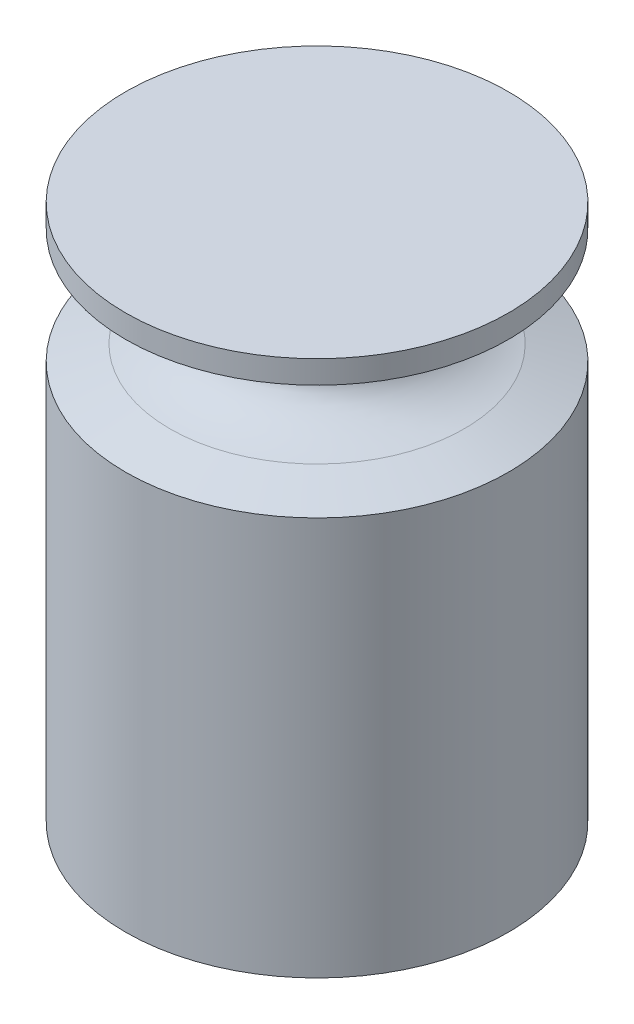
ISO-10303-21;
HEADER;
FILE_DESCRIPTION(('STEP AP214'),'2;1');
FILE_NAME('part.step','',(''),(''),'','','');
FILE_SCHEMA(('AUTOMOTIVE_DESIGN { 1 0 10303 214 1 1 1 1 }'));
ENDSEC;
DATA;
#1=APPLICATION_CONTEXT('core data for automotive mechanical design processes');
#2=APPLICATION_PROTOCOL_DEFINITION('international standard','automotive_design',2000,#1);
#3=PRODUCT_CONTEXT('',#1,'mechanical');
#4=PRODUCT('Part','Part','',(#3));
#5=PRODUCT_RELATED_PRODUCT_CATEGORY('part','',(#4));
#6=PRODUCT_DEFINITION_FORMATION('','',#4);
#7=PRODUCT_DEFINITION_CONTEXT('part definition',#1,'design');
#8=PRODUCT_DEFINITION('design','',#6,#7);
#9=PRODUCT_DEFINITION_SHAPE('','',#8);
#10=(LENGTH_UNIT() NAMED_UNIT(*) SI_UNIT(.MILLI.,.METRE.));
#11=(NAMED_UNIT(*) PLANE_ANGLE_UNIT() SI_UNIT($,.RADIAN.));
#12=(NAMED_UNIT(*) SI_UNIT($,.STERADIAN.) SOLID_ANGLE_UNIT());
#13=UNCERTAINTY_MEASURE_WITH_UNIT(LENGTH_MEASURE(1.E-05),#10,'distance_accuracy_value','');
#14=(GEOMETRIC_REPRESENTATION_CONTEXT(3) GLOBAL_UNCERTAINTY_ASSIGNED_CONTEXT((#13)) GLOBAL_UNIT_ASSIGNED_CONTEXT((#10,
#11,#12)) REPRESENTATION_CONTEXT('',''));
#15=CARTESIAN_POINT('',(0.,0.,0.));
#16=DIRECTION('',(0.,0.,1.));
#17=DIRECTION('',(1.,0.,0.));
#18=AXIS2_PLACEMENT_3D('',#15,#16,#17);
#19=CARTESIAN_POINT('',(0.,70.,0.));
#20=DIRECTION('',(0.,-1.,0.));
#21=DIRECTION('',(0.,0.,-1.));
#22=AXIS2_PLACEMENT_3D('',#19,#20,#21);
#23=CYLINDRICAL_SURFACE('',#22,25.);
#24=CARTESIAN_POINT('',(0.,52.,0.));
#25=DIRECTION('',(0.,1.,0.));
#26=DIRECTION('',(0.,0.,1.));
#27=AXIS2_PLACEMENT_3D('',#24,#25,#26);
#28=CIRCLE('',#27,25.);
#29=CARTESIAN_POINT('',(0.,52.,25.));
#30=VERTEX_POINT('',#29);
#31=EDGE_CURVE('E47',#30,#30,#28,.T.);
#32=ORIENTED_EDGE('',*,*,#31,.F.);
#33=EDGE_LOOP('',(#32));
#34=FACE_BOUND('',#33,.T.);
#35=CARTESIAN_POINT('',(0.,0.,0.));
#36=DIRECTION('',(0.,1.,0.));
#37=DIRECTION('',(0.,0.,1.));
#38=AXIS2_PLACEMENT_3D('',#35,#36,#37);
#39=CIRCLE('',#38,25.);
#40=CARTESIAN_POINT('',(0.,0.,25.));
#41=VERTEX_POINT('',#40);
#42=EDGE_CURVE('E40',#41,#41,#39,.T.);
#43=ORIENTED_EDGE('',*,*,#42,.T.);
#44=EDGE_LOOP('',(#43));
#45=FACE_BOUND('',#44,.T.);
#46=ADVANCED_FACE('F36',(#34,#45),#23,.T.);
#47=CARTESIAN_POINT('',(0.,0.,0.));
#48=DIRECTION('',(0.,1.,0.));
#49=DIRECTION('',(0.,0.,1.));
#50=AXIS2_PLACEMENT_3D('',#47,#48,#49);
#51=PLANE('',#50);
#52=ORIENTED_EDGE('',*,*,#42,.F.);
#53=EDGE_LOOP('',(#52));
#54=FACE_BOUND('',#53,.T.);
#55=ADVANCED_FACE('F76',(#54),#51,.F.);
#56=CARTESIAN_POINT('',(0.,52.,0.));
#57=DIRECTION('',(0.,-1.,0.));
#58=DIRECTION('',(0.,0.,-1.));
#59=AXIS2_PLACEMENT_3D('',#56,#57,#58);
#60=CONICAL_SURFACE('',#59,25.,1.23836614702557);
#61=CARTESIAN_POINT('',(0.,54.,0.));
#62=DIRECTION('',(0.,1.,0.));
#63=DIRECTION('',(0.,0.,1.));
#64=AXIS2_PLACEMENT_3D('',#61,#62,#63);
#65=CIRCLE('',#64,19.2069693119544);
#66=CARTESIAN_POINT('',(0.,54.,19.2069693119544));
#67=VERTEX_POINT('',#66);
#68=EDGE_CURVE('E51',#67,#67,#65,.T.);
#69=ORIENTED_EDGE('',*,*,#68,.F.);
#70=EDGE_LOOP('',(#69));
#71=FACE_BOUND('',#70,.T.);
#72=ORIENTED_EDGE('',*,*,#31,.T.);
#73=EDGE_LOOP('',(#72));
#74=FACE_BOUND('',#73,.T.);
#75=ADVANCED_FACE('F72',(#71,#74),#60,.T.);
#76=CARTESIAN_POINT('',(-19.2069693119544,54.,0.));
#77=CARTESIAN_POINT('',(-9.90094319966967,56.4866830119048,0.));
#78=CARTESIAN_POINT('',(-10.6277439256941,62.5133169880952,0.));
#79=CARTESIAN_POINT('',(-19.2069693119544,65.,0.));
#80=B_SPLINE_CURVE_WITH_KNOTS('',3,(#76,#77,#78,#79),.UNSPECIFIED.,.F.,.F.,(4,4),(0.,1.),.UNSPECIFIED.);
#81=CARTESIAN_POINT('',(0.,70.,0.));
#82=DIRECTION('',(0.,1.,0.));
#83=AXIS1_PLACEMENT('',#81,#82);
#84=SURFACE_OF_REVOLUTION('',#80,#83);
#85=CARTESIAN_POINT('',(0.,65.,0.));
#86=DIRECTION('',(0.,1.,0.));
#87=DIRECTION('',(0.,0.,1.));
#88=AXIS2_PLACEMENT_3D('',#85,#86,#87);
#89=CIRCLE('',#88,19.2069693119544);
#90=CARTESIAN_POINT('',(0.,65.,19.2069693119544));
#91=VERTEX_POINT('',#90);
#92=EDGE_CURVE('E54',#91,#91,#89,.T.);
#93=ORIENTED_EDGE('',*,*,#92,.F.);
#94=EDGE_LOOP('',(#93));
#95=FACE_BOUND('',#94,.T.);
#96=ORIENTED_EDGE('',*,*,#68,.T.);
#97=EDGE_LOOP('',(#96));
#98=FACE_BOUND('',#97,.T.);
#99=ADVANCED_FACE('F67',(#95,#98),#84,.T.);
#100=CARTESIAN_POINT('',(0.,65.,0.));
#101=DIRECTION('',(0.,1.,0.));
#102=DIRECTION('',(0.,0.,1.));
#103=AXIS2_PLACEMENT_3D('',#100,#101,#102);
#104=CONICAL_SURFACE('',#103,19.2069693119544,1.23836614702557);
#105=CARTESIAN_POINT('',(0.,67.,0.));
#106=DIRECTION('',(0.,1.,0.));
#107=DIRECTION('',(0.,0.,1.));
#108=AXIS2_PLACEMENT_3D('',#105,#106,#107);
#109=CIRCLE('',#108,25.);
#110=CARTESIAN_POINT('',(0.,67.,25.));
#111=VERTEX_POINT('',#110);
#112=EDGE_CURVE('E57',#111,#111,#109,.T.);
#113=ORIENTED_EDGE('',*,*,#112,.F.);
#114=EDGE_LOOP('',(#113));
#115=FACE_BOUND('',#114,.T.);
#116=ORIENTED_EDGE('',*,*,#92,.T.);
#117=EDGE_LOOP('',(#116));
#118=FACE_BOUND('',#117,.T.);
#119=ADVANCED_FACE('F71',(#115,#118),#104,.T.);
#120=CARTESIAN_POINT('',(0.,70.,0.));
#121=DIRECTION('',(0.,1.,0.));
#122=DIRECTION('',(0.,0.,1.));
#123=AXIS2_PLACEMENT_3D('',#120,#121,#122);
#124=PLANE('',#123);
#125=CARTESIAN_POINT('',(0.,70.,0.));
#126=DIRECTION('',(0.,1.,0.));
#127=DIRECTION('',(0.,0.,1.));
#128=AXIS2_PLACEMENT_3D('',#125,#126,#127);
#129=CIRCLE('',#128,25.);
#130=CARTESIAN_POINT('',(0.,70.,25.));
#131=VERTEX_POINT('',#130);
#132=EDGE_CURVE('E10',#131,#131,#129,.T.);
#133=ORIENTED_EDGE('',*,*,#132,.T.);
#134=EDGE_LOOP('',(#133));
#135=FACE_BOUND('',#134,.T.);
#136=ADVANCED_FACE('F78',(#135),#124,.T.);
#137=ORIENTED_EDGE('',*,*,#112,.T.);
#138=EDGE_LOOP('',(#137));
#139=FACE_BOUND('',#138,.T.);
#140=ORIENTED_EDGE('',*,*,#132,.F.);
#141=EDGE_LOOP('',(#140));
#142=FACE_BOUND('',#141,.T.);
#143=ADVANCED_FACE('F38',(#139,#142),#23,.T.);
#144=CLOSED_SHELL('',(#46,#55,#75,#99,#119,#136,#143));
#145=MANIFOLD_SOLID_BREP('B2',#144);
#146=ADVANCED_BREP_SHAPE_REPRESENTATION('',(#18,#145),#14);
#147=SHAPE_DEFINITION_REPRESENTATION(#9,#146);
ENDSEC;
END-ISO-10303-21;
